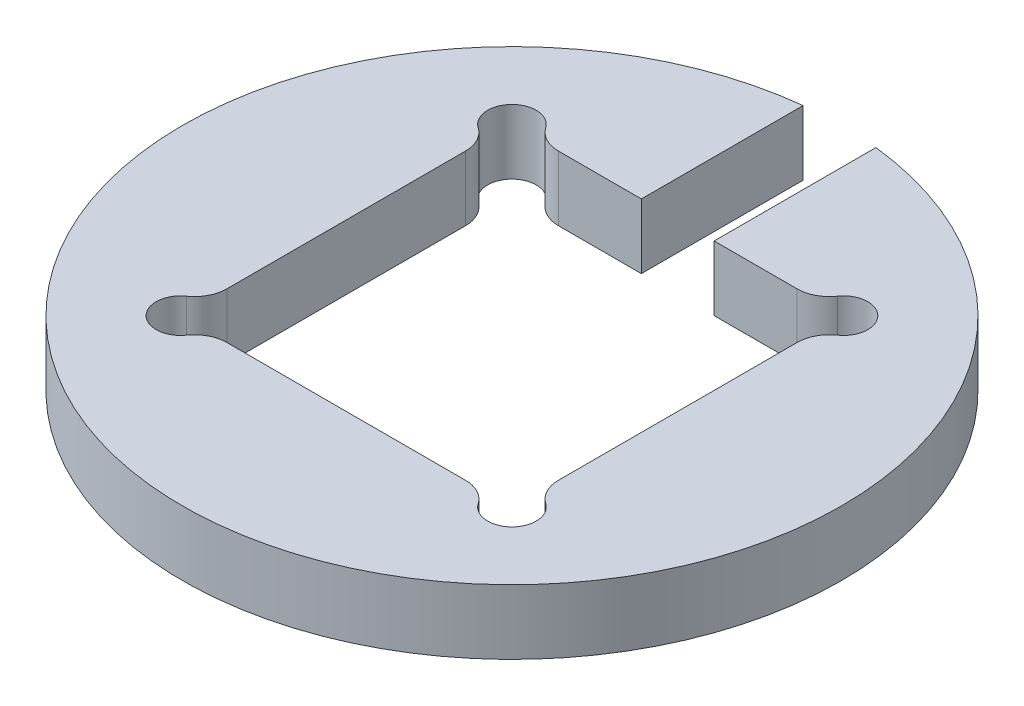
ISO-10303-21;
HEADER;
FILE_DESCRIPTION(('STEP AP214'),'2;1');
FILE_NAME('part.step','',(''),(''),'','','');
FILE_SCHEMA(('AUTOMOTIVE_DESIGN { 1 0 10303 214 1 1 1 1 }'));
ENDSEC;
DATA;
#1=APPLICATION_CONTEXT('core data for automotive mechanical design processes');
#2=APPLICATION_PROTOCOL_DEFINITION('international standard','automotive_design',2000,#1);
#3=PRODUCT_CONTEXT('',#1,'mechanical');
#4=PRODUCT('Part','Part','',(#3));
#5=PRODUCT_RELATED_PRODUCT_CATEGORY('part','',(#4));
#6=PRODUCT_DEFINITION_FORMATION('','',#4);
#7=PRODUCT_DEFINITION_CONTEXT('part definition',#1,'design');
#8=PRODUCT_DEFINITION('design','',#6,#7);
#9=PRODUCT_DEFINITION_SHAPE('','',#8);
#10=(LENGTH_UNIT() NAMED_UNIT(*) SI_UNIT(.MILLI.,.METRE.));
#11=(NAMED_UNIT(*) PLANE_ANGLE_UNIT() SI_UNIT($,.RADIAN.));
#12=(NAMED_UNIT(*) SI_UNIT($,.STERADIAN.) SOLID_ANGLE_UNIT());
#13=UNCERTAINTY_MEASURE_WITH_UNIT(LENGTH_MEASURE(1.E-05),#10,'distance_accuracy_value','');
#14=(GEOMETRIC_REPRESENTATION_CONTEXT(3) GLOBAL_UNCERTAINTY_ASSIGNED_CONTEXT((#13)) GLOBAL_UNIT_ASSIGNED_CONTEXT((#10,
#11,#12)) REPRESENTATION_CONTEXT('',''));
#15=CARTESIAN_POINT('',(0.,0.,0.));
#16=DIRECTION('',(0.,0.,1.));
#17=DIRECTION('',(1.,0.,0.));
#18=AXIS2_PLACEMENT_3D('',#15,#16,#17);
#19=CARTESIAN_POINT('',(0.,4.,-20.5));
#20=DIRECTION('',(0.,-1.,0.));
#21=DIRECTION('',(0.,0.,-1.));
#22=AXIS2_PLACEMENT_3D('',#19,#20,#21);
#23=CYLINDRICAL_SURFACE('',#22,1.5);
#24=CARTESIAN_POINT('',(0.,4.,-20.5));
#25=DIRECTION('',(0.,1.,0.));
#26=DIRECTION('',(0.,0.,1.));
#27=AXIS2_PLACEMENT_3D('',#24,#25,#26);
#28=CIRCLE('',#27,1.5);
#29=CARTESIAN_POINT('',(1.23097770997243,4.,-21.3571428571429));
#30=VERTEX_POINT('',#29);
#31=CARTESIAN_POINT('',(-0.857142857142857,4.,-19.2690222900276));
#32=VERTEX_POINT('',#31);
#33=EDGE_CURVE('E185',#30,#32,#28,.T.);
#34=ORIENTED_EDGE('',*,*,#33,.T.);
#35=DIRECTION('',(0.,-1.,0.));
#36=VECTOR('',#35,1.);
#37=CARTESIAN_POINT('',(-0.857142857142857,4.,-19.2690222900276));
#38=LINE('',#37,#36);
#39=CARTESIAN_POINT('',(-0.857142857142857,0.,-19.2690222900276));
#40=VERTEX_POINT('',#39);
#41=EDGE_CURVE('E322',#32,#40,#38,.T.);
#42=ORIENTED_EDGE('',*,*,#41,.T.);
#43=CARTESIAN_POINT('',(0.,0.,-20.5));
#44=DIRECTION('',(0.,1.,0.));
#45=DIRECTION('',(0.,0.,1.));
#46=AXIS2_PLACEMENT_3D('',#43,#44,#45);
#47=CIRCLE('',#46,1.5);
#48=CARTESIAN_POINT('',(1.23097770997243,0.,-21.3571428571429));
#49=VERTEX_POINT('',#48);
#50=EDGE_CURVE('E226',#49,#40,#47,.T.);
#51=ORIENTED_EDGE('',*,*,#50,.F.);
#52=DIRECTION('',(0.,-1.,0.));
#53=VECTOR('',#52,1.);
#54=CARTESIAN_POINT('',(1.23097770997244,4.,-21.3571428571429));
#55=LINE('',#54,#53);
#56=EDGE_CURVE('E320',#49,#30,#55,.F.);
#57=ORIENTED_EDGE('',*,*,#56,.T.);
#58=EDGE_LOOP('',(#34,#42,#51,#57));
#59=FACE_BOUND('',#58,.T.);
#60=ADVANCED_FACE('F35',(#59),#23,.F.);
#61=CARTESIAN_POINT('',(0.,4.,-20.5));
#62=DIRECTION('',(0.,0.,-1.));
#63=DIRECTION('',(-1.,0.,0.));
#64=AXIS2_PLACEMENT_3D('',#61,#62,#63);
#65=PLANE('',#64);
#66=DIRECTION('',(1.,0.,0.));
#67=VECTOR('',#66,1.);
#68=CARTESIAN_POINT('',(0.,4.,-20.5));
#69=LINE('',#68,#67);
#70=CARTESIAN_POINT('',(2.87228132326902,4.,-20.5));
#71=VERTEX_POINT('',#70);
#72=CARTESIAN_POINT('',(8.,4.,-20.5));
#73=VERTEX_POINT('',#72);
#74=EDGE_CURVE('E172',#71,#73,#69,.T.);
#75=ORIENTED_EDGE('',*,*,#74,.F.);
#76=DIRECTION('',(0.,1.,0.));
#77=VECTOR('',#76,1.);
#78=CARTESIAN_POINT('',(2.87228132326902,0.,-20.5));
#79=LINE('',#78,#77);
#80=CARTESIAN_POINT('',(2.87228132326902,0.,-20.5));
#81=VERTEX_POINT('',#80);
#82=EDGE_CURVE('E11',#71,#81,#79,.F.);
#83=ORIENTED_EDGE('',*,*,#82,.T.);
#84=DIRECTION('',(1.,0.,0.));
#85=VECTOR('',#84,1.);
#86=CARTESIAN_POINT('',(0.,0.,-20.5));
#87=LINE('',#86,#85);
#88=CARTESIAN_POINT('',(8.,0.,-20.5));
#89=VERTEX_POINT('',#88);
#90=EDGE_CURVE('E191',#81,#89,#87,.T.);
#91=ORIENTED_EDGE('',*,*,#90,.T.);
#92=DIRECTION('',(0.,-1.,0.));
#93=VECTOR('',#92,1.);
#94=CARTESIAN_POINT('',(8.,4.,-20.5));
#95=LINE('',#94,#93);
#96=EDGE_CURVE('E188',#73,#89,#95,.T.);
#97=ORIENTED_EDGE('',*,*,#96,.F.);
#98=EDGE_LOOP('',(#75,#83,#91,#97));
#99=FACE_BOUND('',#98,.T.);
#100=ADVANCED_FACE('F189',(#99),#65,.F.);
#101=CARTESIAN_POINT('',(8.,4.,0.));
#102=DIRECTION('',(-1.,0.,0.));
#103=DIRECTION('',(0.,0.,1.));
#104=AXIS2_PLACEMENT_3D('',#101,#102,#103);
#105=PLANE('',#104);
#106=DIRECTION('',(0.,0.,-1.));
#107=VECTOR('',#106,1.);
#108=CARTESIAN_POINT('',(8.,0.,0.));
#109=LINE('',#108,#107);
#110=CARTESIAN_POINT('',(8.,0.,-30.5));
#111=VERTEX_POINT('',#110);
#112=EDGE_CURVE('E230',#89,#111,#109,.T.);
#113=ORIENTED_EDGE('',*,*,#112,.T.);
#114=DIRECTION('',(0.,-1.,0.));
#115=VECTOR('',#114,1.);
#116=CARTESIAN_POINT('',(8.,4.,-30.5));
#117=LINE('',#116,#115);
#118=CARTESIAN_POINT('',(8.,4.,-30.5));
#119=VERTEX_POINT('',#118);
#120=EDGE_CURVE('E196',#119,#111,#117,.T.);
#121=ORIENTED_EDGE('',*,*,#120,.F.);
#122=DIRECTION('',(0.,0.,-1.));
#123=VECTOR('',#122,1.);
#124=CARTESIAN_POINT('',(8.,4.,0.));
#125=LINE('',#124,#123);
#126=EDGE_CURVE('E178',#73,#119,#125,.T.);
#127=ORIENTED_EDGE('',*,*,#126,.F.);
#128=ORIENTED_EDGE('',*,*,#96,.T.);
#129=EDGE_LOOP('',(#113,#121,#127,#128));
#130=FACE_BOUND('',#129,.T.);
#131=ADVANCED_FACE('F198',(#130),#105,.F.);
#132=CARTESIAN_POINT('',(10.25,4.,-10.25));
#133=DIRECTION('',(0.,-1.,0.));
#134=DIRECTION('',(0.,0.,-1.));
#135=AXIS2_PLACEMENT_3D('',#132,#133,#134);
#136=CYLINDRICAL_SURFACE('',#135,20.3746165608092);
#137=CARTESIAN_POINT('',(10.25,0.,-10.25));
#138=DIRECTION('',(0.,1.,0.));
#139=DIRECTION('',(0.,0.,1.));
#140=AXIS2_PLACEMENT_3D('',#137,#138,#139);
#141=CIRCLE('',#140,20.3746165608092);
#142=CARTESIAN_POINT('',(12.5,0.,-30.5));
#143=VERTEX_POINT('',#142);
#144=EDGE_CURVE('E232',#143,#111,#141,.F.);
#145=ORIENTED_EDGE('',*,*,#144,.F.);
#146=DIRECTION('',(0.,-1.,0.));
#147=VECTOR('',#146,1.);
#148=CARTESIAN_POINT('',(12.5,4.,-30.5));
#149=LINE('',#148,#147);
#150=CARTESIAN_POINT('',(12.5,4.,-30.5));
#151=VERTEX_POINT('',#150);
#152=EDGE_CURVE('E259',#151,#143,#149,.T.);
#153=ORIENTED_EDGE('',*,*,#152,.F.);
#154=CARTESIAN_POINT('',(10.25,4.,-10.25));
#155=DIRECTION('',(0.,1.,0.));
#156=DIRECTION('',(0.,0.,1.));
#157=AXIS2_PLACEMENT_3D('',#154,#155,#156);
#158=CIRCLE('',#157,20.3746165608092);
#159=EDGE_CURVE('E200',#151,#119,#158,.F.);
#160=ORIENTED_EDGE('',*,*,#159,.T.);
#161=ORIENTED_EDGE('',*,*,#120,.T.);
#162=EDGE_LOOP('',(#145,#153,#160,#161));
#163=FACE_BOUND('',#162,.T.);
#164=ADVANCED_FACE('F528',(#163),#136,.T.);
#165=CARTESIAN_POINT('',(12.5,4.,0.));
#166=DIRECTION('',(-1.,0.,0.));
#167=DIRECTION('',(0.,0.,1.));
#168=AXIS2_PLACEMENT_3D('',#165,#166,#167);
#169=PLANE('',#168);
#170=DIRECTION('',(0.,0.,-1.));
#171=VECTOR('',#170,1.);
#172=CARTESIAN_POINT('',(12.5,0.,0.));
#173=LINE('',#172,#171);
#174=CARTESIAN_POINT('',(12.5,0.,-20.5));
#175=VERTEX_POINT('',#174);
#176=EDGE_CURVE('E235',#175,#143,#173,.T.);
#177=ORIENTED_EDGE('',*,*,#176,.F.);
#178=DIRECTION('',(0.,-1.,0.));
#179=VECTOR('',#178,1.);
#180=CARTESIAN_POINT('',(12.5,4.,-20.5));
#181=LINE('',#180,#179);
#182=CARTESIAN_POINT('',(12.5,4.,-20.5));
#183=VERTEX_POINT('',#182);
#184=EDGE_CURVE('E225',#183,#175,#181,.T.);
#185=ORIENTED_EDGE('',*,*,#184,.F.);
#186=DIRECTION('',(0.,0.,-1.));
#187=VECTOR('',#186,1.);
#188=CARTESIAN_POINT('',(12.5,4.,0.));
#189=LINE('',#188,#187);
#190=EDGE_CURVE('E202',#183,#151,#189,.T.);
#191=ORIENTED_EDGE('',*,*,#190,.T.);
#192=ORIENTED_EDGE('',*,*,#152,.T.);
#193=EDGE_LOOP('',(#177,#185,#191,#192));
#194=FACE_BOUND('',#193,.T.);
#195=ADVANCED_FACE('F519',(#194),#169,.T.);
#196=CARTESIAN_POINT('',(0.,4.,-20.5));
#197=DIRECTION('',(0.,0.,1.));
#198=DIRECTION('',(1.,0.,0.));
#199=AXIS2_PLACEMENT_3D('',#196,#197,#198);
#200=PLANE('',#199);
#201=DIRECTION('',(-1.,0.,0.));
#202=VECTOR('',#201,1.);
#203=CARTESIAN_POINT('',(0.,0.,-20.5));
#204=LINE('',#203,#202);
#205=CARTESIAN_POINT('',(17.627718676731,0.,-20.5));
#206=VERTEX_POINT('',#205);
#207=EDGE_CURVE('E238',#206,#175,#204,.T.);
#208=ORIENTED_EDGE('',*,*,#207,.F.);
#209=DIRECTION('',(0.,1.,0.));
#210=VECTOR('',#209,1.);
#211=CARTESIAN_POINT('',(17.627718676731,4.,-20.5));
#212=LINE('',#211,#210);
#213=CARTESIAN_POINT('',(17.627718676731,4.,-20.5));
#214=VERTEX_POINT('',#213);
#215=EDGE_CURVE('E43',#206,#214,#212,.T.);
#216=ORIENTED_EDGE('',*,*,#215,.T.);
#217=DIRECTION('',(-1.,0.,0.));
#218=VECTOR('',#217,1.);
#219=CARTESIAN_POINT('',(0.,4.,-20.5));
#220=LINE('',#219,#218);
#221=EDGE_CURVE('E208',#214,#183,#220,.T.);
#222=ORIENTED_EDGE('',*,*,#221,.T.);
#223=ORIENTED_EDGE('',*,*,#184,.T.);
#224=EDGE_LOOP('',(#208,#216,#222,#223));
#225=FACE_BOUND('',#224,.T.);
#226=ADVANCED_FACE('F328',(#225),#200,.T.);
#227=CARTESIAN_POINT('',(20.5,4.,-20.5));
#228=DIRECTION('',(0.,-1.,0.));
#229=DIRECTION('',(0.,0.,-1.));
#230=AXIS2_PLACEMENT_3D('',#227,#228,#229);
#231=CYLINDRICAL_SURFACE('',#230,1.5);
#232=CARTESIAN_POINT('',(20.5,0.,-20.5));
#233=DIRECTION('',(0.,1.,0.));
#234=DIRECTION('',(0.,0.,1.));
#235=AXIS2_PLACEMENT_3D('',#232,#233,#234);
#236=CIRCLE('',#235,1.5);
#237=CARTESIAN_POINT('',(19.2690222900276,0.,-21.3571428571429));
#238=VERTEX_POINT('',#237);
#239=CARTESIAN_POINT('',(21.3571428571429,0.,-19.2690222900276));
#240=VERTEX_POINT('',#239);
#241=EDGE_CURVE('E240',#238,#240,#236,.F.);
#242=ORIENTED_EDGE('',*,*,#241,.T.);
#243=DIRECTION('',(0.,-1.,0.));
#244=VECTOR('',#243,1.);
#245=CARTESIAN_POINT('',(21.3571428571429,4.,-19.2690222900276));
#246=LINE('',#245,#244);
#247=CARTESIAN_POINT('',(21.3571428571429,4.,-19.2690222900276));
#248=VERTEX_POINT('',#247);
#249=EDGE_CURVE('E309',#240,#248,#246,.F.);
#250=ORIENTED_EDGE('',*,*,#249,.T.);
#251=CARTESIAN_POINT('',(20.5,4.,-20.5));
#252=DIRECTION('',(0.,1.,0.));
#253=DIRECTION('',(0.,0.,1.));
#254=AXIS2_PLACEMENT_3D('',#251,#252,#253);
#255=CIRCLE('',#254,1.5);
#256=CARTESIAN_POINT('',(19.2690222900276,4.,-21.3571428571429));
#257=VERTEX_POINT('',#256);
#258=EDGE_CURVE('E210',#257,#248,#255,.F.);
#259=ORIENTED_EDGE('',*,*,#258,.F.);
#260=DIRECTION('',(0.,-1.,0.));
#261=VECTOR('',#260,1.);
#262=CARTESIAN_POINT('',(19.2690222900276,4.,-21.3571428571429));
#263=LINE('',#262,#261);
#264=EDGE_CURVE('E306',#257,#238,#263,.T.);
#265=ORIENTED_EDGE('',*,*,#264,.T.);
#266=EDGE_LOOP('',(#242,#250,#259,#265));
#267=FACE_BOUND('',#266,.T.);
#268=ADVANCED_FACE('F338',(#267),#231,.F.);
#269=CARTESIAN_POINT('',(20.5,4.,0.));
#270=DIRECTION('',(-1.,0.,0.));
#271=DIRECTION('',(0.,0.,1.));
#272=AXIS2_PLACEMENT_3D('',#269,#270,#271);
#273=PLANE('',#272);
#274=DIRECTION('',(0.,0.,-1.));
#275=VECTOR('',#274,1.);
#276=CARTESIAN_POINT('',(20.5,0.,0.));
#277=LINE('',#276,#275);
#278=CARTESIAN_POINT('',(20.5,0.,-2.87228132326902));
#279=VERTEX_POINT('',#278);
#280=CARTESIAN_POINT('',(20.5,0.,-17.627718676731));
#281=VERTEX_POINT('',#280);
#282=EDGE_CURVE('E243',#279,#281,#277,.T.);
#283=ORIENTED_EDGE('',*,*,#282,.F.);
#284=DIRECTION('',(0.,1.,0.));
#285=VECTOR('',#284,1.);
#286=CARTESIAN_POINT('',(20.5,4.,-2.87228132326902));
#287=LINE('',#286,#285);
#288=CARTESIAN_POINT('',(20.5,4.,-2.87228132326902));
#289=VERTEX_POINT('',#288);
#290=EDGE_CURVE('E304',#279,#289,#287,.T.);
#291=ORIENTED_EDGE('',*,*,#290,.T.);
#292=DIRECTION('',(0.,0.,-1.));
#293=VECTOR('',#292,1.);
#294=CARTESIAN_POINT('',(20.5,4.,0.));
#295=LINE('',#294,#293);
#296=CARTESIAN_POINT('',(20.5,4.,-17.627718676731));
#297=VERTEX_POINT('',#296);
#298=EDGE_CURVE('E213',#289,#297,#295,.T.);
#299=ORIENTED_EDGE('',*,*,#298,.T.);
#300=DIRECTION('',(0.,1.,0.));
#301=VECTOR('',#300,1.);
#302=CARTESIAN_POINT('',(20.5,0.,-17.627718676731));
#303=LINE('',#302,#301);
#304=EDGE_CURVE('E301',#297,#281,#303,.F.);
#305=ORIENTED_EDGE('',*,*,#304,.T.);
#306=EDGE_LOOP('',(#283,#291,#299,#305));
#307=FACE_BOUND('',#306,.T.);
#308=ADVANCED_FACE('F348',(#307),#273,.T.);
#309=CARTESIAN_POINT('',(20.5,4.,0.));
#310=DIRECTION('',(0.,-1.,0.));
#311=DIRECTION('',(0.,0.,-1.));
#312=AXIS2_PLACEMENT_3D('',#309,#310,#311);
#313=CYLINDRICAL_SURFACE('',#312,1.5);
#314=CARTESIAN_POINT('',(20.5,0.,0.));
#315=DIRECTION('',(0.,1.,0.));
#316=DIRECTION('',(0.,0.,1.));
#317=AXIS2_PLACEMENT_3D('',#314,#315,#316);
#318=CIRCLE('',#317,1.5);
#319=CARTESIAN_POINT('',(21.3571428571429,0.,-1.23097770997243));
#320=VERTEX_POINT('',#319);
#321=CARTESIAN_POINT('',(19.2690222900276,0.,0.857142857142857));
#322=VERTEX_POINT('',#321);
#323=EDGE_CURVE('E246',#320,#322,#318,.F.);
#324=ORIENTED_EDGE('',*,*,#323,.T.);
#325=DIRECTION('',(0.,-1.,0.));
#326=VECTOR('',#325,1.);
#327=CARTESIAN_POINT('',(19.2690222900276,4.,0.857142857142857));
#328=LINE('',#327,#326);
#329=CARTESIAN_POINT('',(19.2690222900276,4.,0.857142857142857));
#330=VERTEX_POINT('',#329);
#331=EDGE_CURVE('E285',#322,#330,#328,.F.);
#332=ORIENTED_EDGE('',*,*,#331,.T.);
#333=CARTESIAN_POINT('',(20.5,4.,0.));
#334=DIRECTION('',(0.,1.,0.));
#335=DIRECTION('',(0.,0.,1.));
#336=AXIS2_PLACEMENT_3D('',#333,#334,#335);
#337=CIRCLE('',#336,1.5);
#338=CARTESIAN_POINT('',(21.3571428571429,4.,-1.23097770997243));
#339=VERTEX_POINT('',#338);
#340=EDGE_CURVE('E216',#339,#330,#337,.F.);
#341=ORIENTED_EDGE('',*,*,#340,.F.);
#342=DIRECTION('',(0.,-1.,0.));
#343=VECTOR('',#342,1.);
#344=CARTESIAN_POINT('',(21.3571428571429,4.,-1.23097770997244));
#345=LINE('',#344,#343);
#346=EDGE_CURVE('E282',#339,#320,#345,.T.);
#347=ORIENTED_EDGE('',*,*,#346,.T.);
#348=EDGE_LOOP('',(#324,#332,#341,#347));
#349=FACE_BOUND('',#348,.T.);
#350=ADVANCED_FACE('F358',(#349),#313,.F.);
#351=CARTESIAN_POINT('',(0.,4.,0.));
#352=DIRECTION('',(0.,0.,-1.));
#353=DIRECTION('',(-1.,0.,0.));
#354=AXIS2_PLACEMENT_3D('',#351,#352,#353);
#355=PLANE('',#354);
#356=DIRECTION('',(1.,0.,0.));
#357=VECTOR('',#356,1.);
#358=CARTESIAN_POINT('',(0.,4.,0.));
#359=LINE('',#358,#357);
#360=CARTESIAN_POINT('',(2.87228132326901,4.,0.));
#361=VERTEX_POINT('',#360);
#362=CARTESIAN_POINT('',(17.627718676731,4.,0.));
#363=VERTEX_POINT('',#362);
#364=EDGE_CURVE('E218',#361,#363,#359,.T.);
#365=ORIENTED_EDGE('',*,*,#364,.T.);
#366=DIRECTION('',(0.,1.,0.));
#367=VECTOR('',#366,1.);
#368=CARTESIAN_POINT('',(17.627718676731,0.,0.));
#369=LINE('',#368,#367);
#370=CARTESIAN_POINT('',(17.627718676731,0.,0.));
#371=VERTEX_POINT('',#370);
#372=EDGE_CURVE('E263',#363,#371,#369,.F.);
#373=ORIENTED_EDGE('',*,*,#372,.T.);
#374=DIRECTION('',(1.,0.,0.));
#375=VECTOR('',#374,1.);
#376=CARTESIAN_POINT('',(0.,0.,0.));
#377=LINE('',#376,#375);
#378=CARTESIAN_POINT('',(2.87228132326901,0.,0.));
#379=VERTEX_POINT('',#378);
#380=EDGE_CURVE('E249',#379,#371,#377,.T.);
#381=ORIENTED_EDGE('',*,*,#380,.F.);
#382=DIRECTION('',(0.,1.,0.));
#383=VECTOR('',#382,1.);
#384=CARTESIAN_POINT('',(2.87228132326901,4.,0.));
#385=LINE('',#384,#383);
#386=EDGE_CURVE('E195',#379,#361,#385,.T.);
#387=ORIENTED_EDGE('',*,*,#386,.T.);
#388=EDGE_LOOP('',(#365,#373,#381,#387));
#389=FACE_BOUND('',#388,.T.);
#390=ADVANCED_FACE('F366',(#389),#355,.T.);
#391=CARTESIAN_POINT('',(0.,4.,0.));
#392=DIRECTION('',(0.,-1.,0.));
#393=DIRECTION('',(0.,0.,-1.));
#394=AXIS2_PLACEMENT_3D('',#391,#392,#393);
#395=CYLINDRICAL_SURFACE('',#394,1.5);
#396=CARTESIAN_POINT('',(0.,0.,0.));
#397=DIRECTION('',(0.,1.,0.));
#398=DIRECTION('',(0.,0.,1.));
#399=AXIS2_PLACEMENT_3D('',#396,#397,#398);
#400=CIRCLE('',#399,1.5);
#401=CARTESIAN_POINT('',(1.23097770997243,0.,0.857142857142857));
#402=VERTEX_POINT('',#401);
#403=CARTESIAN_POINT('',(-0.857142857142857,0.,-1.23097770997243));
#404=VERTEX_POINT('',#403);
#405=EDGE_CURVE('E252',#402,#404,#400,.F.);
#406=ORIENTED_EDGE('',*,*,#405,.T.);
#407=DIRECTION('',(0.,-1.,0.));
#408=VECTOR('',#407,1.);
#409=CARTESIAN_POINT('',(-0.857142857142857,4.,-1.23097770997243));
#410=LINE('',#409,#408);
#411=CARTESIAN_POINT('',(-0.857142857142857,4.,-1.23097770997243));
#412=VERTEX_POINT('',#411);
#413=EDGE_CURVE('E318',#404,#412,#410,.F.);
#414=ORIENTED_EDGE('',*,*,#413,.T.);
#415=CARTESIAN_POINT('',(0.,4.,0.));
#416=DIRECTION('',(0.,1.,0.));
#417=DIRECTION('',(0.,0.,1.));
#418=AXIS2_PLACEMENT_3D('',#415,#416,#417);
#419=CIRCLE('',#418,1.5);
#420=CARTESIAN_POINT('',(1.23097770997243,4.,0.857142857142857));
#421=VERTEX_POINT('',#420);
#422=EDGE_CURVE('E221',#421,#412,#419,.F.);
#423=ORIENTED_EDGE('',*,*,#422,.F.);
#424=DIRECTION('',(0.,-1.,0.));
#425=VECTOR('',#424,1.);
#426=CARTESIAN_POINT('',(1.23097770997243,4.,0.857142857142857));
#427=LINE('',#426,#425);
#428=EDGE_CURVE('E315',#421,#402,#427,.T.);
#429=ORIENTED_EDGE('',*,*,#428,.T.);
#430=EDGE_LOOP('',(#406,#414,#423,#429));
#431=FACE_BOUND('',#430,.T.);
#432=ADVANCED_FACE('F376',(#431),#395,.F.);
#433=CARTESIAN_POINT('',(0.,4.,0.));
#434=DIRECTION('',(-1.,0.,0.));
#435=DIRECTION('',(0.,0.,1.));
#436=AXIS2_PLACEMENT_3D('',#433,#434,#435);
#437=PLANE('',#436);
#438=DIRECTION('',(0.,0.,-1.));
#439=VECTOR('',#438,1.);
#440=CARTESIAN_POINT('',(0.,4.,0.));
#441=LINE('',#440,#439);
#442=CARTESIAN_POINT('',(0.,4.,-2.87228132326901));
#443=VERTEX_POINT('',#442);
#444=CARTESIAN_POINT('',(0.,4.,-17.627718676731));
#445=VERTEX_POINT('',#444);
#446=EDGE_CURVE('E223',#443,#445,#441,.T.);
#447=ORIENTED_EDGE('',*,*,#446,.F.);
#448=DIRECTION('',(0.,-1.,0.));
#449=VECTOR('',#448,1.);
#450=CARTESIAN_POINT('',(0.,4.,-2.87228132326901));
#451=LINE('',#450,#449);
#452=CARTESIAN_POINT('',(0.,0.,-2.87228132326901));
#453=VERTEX_POINT('',#452);
#454=EDGE_CURVE('E312',#443,#453,#451,.T.);
#455=ORIENTED_EDGE('',*,*,#454,.T.);
#456=DIRECTION('',(0.,0.,-1.));
#457=VECTOR('',#456,1.);
#458=CARTESIAN_POINT('',(0.,0.,0.));
#459=LINE('',#458,#457);
#460=CARTESIAN_POINT('',(0.,0.,-17.627718676731));
#461=VERTEX_POINT('',#460);
#462=EDGE_CURVE('E255',#453,#461,#459,.T.);
#463=ORIENTED_EDGE('',*,*,#462,.T.);
#464=DIRECTION('',(0.,1.,0.));
#465=VECTOR('',#464,1.);
#466=CARTESIAN_POINT('',(0.,4.,-17.627718676731));
#467=LINE('',#466,#465);
#468=EDGE_CURVE('E50',#461,#445,#467,.T.);
#469=ORIENTED_EDGE('',*,*,#468,.T.);
#470=EDGE_LOOP('',(#447,#455,#463,#469));
#471=FACE_BOUND('',#470,.T.);
#472=ADVANCED_FACE('F382',(#471),#437,.F.);
#473=CARTESIAN_POINT('',(0.,4.,0.));
#474=DIRECTION('',(0.,1.,0.));
#475=DIRECTION('',(0.,0.,1.));
#476=AXIS2_PLACEMENT_3D('',#473,#474,#475);
#477=PLANE('',#476);
#478=ORIENTED_EDGE('',*,*,#340,.T.);
#479=CARTESIAN_POINT('',(17.627718676731,4.,2.));
#480=DIRECTION('',(0.,1.,0.));
#481=DIRECTION('',(0.,0.,1.));
#482=AXIS2_PLACEMENT_3D('',#479,#480,#481);
#483=CIRCLE('',#482,2.);
#484=EDGE_CURVE('E299',#330,#363,#483,.T.);
#485=ORIENTED_EDGE('',*,*,#484,.T.);
#486=ORIENTED_EDGE('',*,*,#364,.F.);
#487=CARTESIAN_POINT('',(2.87228132326901,4.,2.));
#488=DIRECTION('',(0.,1.,0.));
#489=DIRECTION('',(0.,0.,1.));
#490=AXIS2_PLACEMENT_3D('',#487,#488,#489);
#491=CIRCLE('',#490,2.);
#492=EDGE_CURVE('E292',#361,#421,#491,.T.);
#493=ORIENTED_EDGE('',*,*,#492,.T.);
#494=ORIENTED_EDGE('',*,*,#422,.T.);
#495=CARTESIAN_POINT('',(-2.,4.,-2.87228132326901));
#496=DIRECTION('',(0.,1.,0.));
#497=DIRECTION('',(0.,0.,1.));
#498=AXIS2_PLACEMENT_3D('',#495,#496,#497);
#499=CIRCLE('',#498,2.);
#500=EDGE_CURVE('E57',#412,#443,#499,.T.);
#501=ORIENTED_EDGE('',*,*,#500,.T.);
#502=ORIENTED_EDGE('',*,*,#446,.T.);
#503=CARTESIAN_POINT('',(-2.,4.,-17.627718676731));
#504=DIRECTION('',(0.,1.,0.));
#505=DIRECTION('',(0.,0.,1.));
#506=AXIS2_PLACEMENT_3D('',#503,#504,#505);
#507=CIRCLE('',#506,2.);
#508=EDGE_CURVE('E290',#445,#32,#507,.T.);
#509=ORIENTED_EDGE('',*,*,#508,.T.);
#510=ORIENTED_EDGE('',*,*,#33,.F.);
#511=CARTESIAN_POINT('',(2.87228132326902,4.,-22.5));
#512=DIRECTION('',(0.,1.,0.));
#513=DIRECTION('',(0.,0.,1.));
#514=AXIS2_PLACEMENT_3D('',#511,#512,#513);
#515=CIRCLE('',#514,2.);
#516=EDGE_CURVE('E182',#30,#71,#515,.T.);
#517=ORIENTED_EDGE('',*,*,#516,.T.);
#518=ORIENTED_EDGE('',*,*,#74,.T.);
#519=ORIENTED_EDGE('',*,*,#126,.T.);
#520=ORIENTED_EDGE('',*,*,#159,.F.);
#521=ORIENTED_EDGE('',*,*,#190,.F.);
#522=ORIENTED_EDGE('',*,*,#221,.F.);
#523=CARTESIAN_POINT('',(17.627718676731,4.,-22.5));
#524=DIRECTION('',(0.,1.,0.));
#525=DIRECTION('',(0.,0.,1.));
#526=AXIS2_PLACEMENT_3D('',#523,#524,#525);
#527=CIRCLE('',#526,2.);
#528=EDGE_CURVE('E288',#214,#257,#527,.T.);
#529=ORIENTED_EDGE('',*,*,#528,.T.);
#530=ORIENTED_EDGE('',*,*,#258,.T.);
#531=CARTESIAN_POINT('',(22.5,4.,-17.627718676731));
#532=DIRECTION('',(0.,1.,0.));
#533=DIRECTION('',(0.,0.,1.));
#534=AXIS2_PLACEMENT_3D('',#531,#532,#533);
#535=CIRCLE('',#534,2.);
#536=EDGE_CURVE('E295',#248,#297,#535,.T.);
#537=ORIENTED_EDGE('',*,*,#536,.T.);
#538=ORIENTED_EDGE('',*,*,#298,.F.);
#539=CARTESIAN_POINT('',(22.5,4.,-2.87228132326902));
#540=DIRECTION('',(0.,1.,0.));
#541=DIRECTION('',(0.,0.,1.));
#542=AXIS2_PLACEMENT_3D('',#539,#540,#541);
#543=CIRCLE('',#542,2.);
#544=EDGE_CURVE('E297',#289,#339,#543,.T.);
#545=ORIENTED_EDGE('',*,*,#544,.T.);
#546=EDGE_LOOP('',(#478,#485,#486,#493,#494,#501,#502,#509,#510,#517,#518,#519,#520,#521,#522,
#529,#530,#537,#538,#545));
#547=FACE_BOUND('',#546,.T.);
#548=ADVANCED_FACE('F175',(#547),#477,.T.);
#549=CARTESIAN_POINT('',(0.,0.,0.));
#550=DIRECTION('',(0.,1.,0.));
#551=DIRECTION('',(0.,0.,1.));
#552=AXIS2_PLACEMENT_3D('',#549,#550,#551);
#553=PLANE('',#552);
#554=ORIENTED_EDGE('',*,*,#380,.T.);
#555=CARTESIAN_POINT('',(17.627718676731,0.,2.));
#556=DIRECTION('',(0.,1.,0.));
#557=DIRECTION('',(0.,0.,1.));
#558=AXIS2_PLACEMENT_3D('',#555,#556,#557);
#559=CIRCLE('',#558,2.);
#560=EDGE_CURVE('E280',#371,#322,#559,.F.);
#561=ORIENTED_EDGE('',*,*,#560,.T.);
#562=ORIENTED_EDGE('',*,*,#323,.F.);
#563=CARTESIAN_POINT('',(22.5,0.,-2.87228132326902));
#564=DIRECTION('',(0.,1.,0.));
#565=DIRECTION('',(0.,0.,1.));
#566=AXIS2_PLACEMENT_3D('',#563,#564,#565);
#567=CIRCLE('',#566,2.);
#568=EDGE_CURVE('E278',#320,#279,#567,.F.);
#569=ORIENTED_EDGE('',*,*,#568,.T.);
#570=ORIENTED_EDGE('',*,*,#282,.T.);
#571=CARTESIAN_POINT('',(22.5,0.,-17.627718676731));
#572=DIRECTION('',(0.,1.,0.));
#573=DIRECTION('',(0.,0.,1.));
#574=AXIS2_PLACEMENT_3D('',#571,#572,#573);
#575=CIRCLE('',#574,2.);
#576=EDGE_CURVE('E276',#281,#240,#575,.F.);
#577=ORIENTED_EDGE('',*,*,#576,.T.);
#578=ORIENTED_EDGE('',*,*,#241,.F.);
#579=CARTESIAN_POINT('',(17.627718676731,0.,-22.5));
#580=DIRECTION('',(0.,1.,0.));
#581=DIRECTION('',(0.,0.,1.));
#582=AXIS2_PLACEMENT_3D('',#579,#580,#581);
#583=CIRCLE('',#582,2.);
#584=EDGE_CURVE('E268',#238,#206,#583,.F.);
#585=ORIENTED_EDGE('',*,*,#584,.T.);
#586=ORIENTED_EDGE('',*,*,#207,.T.);
#587=ORIENTED_EDGE('',*,*,#176,.T.);
#588=ORIENTED_EDGE('',*,*,#144,.T.);
#589=ORIENTED_EDGE('',*,*,#112,.F.);
#590=ORIENTED_EDGE('',*,*,#90,.F.);
#591=CARTESIAN_POINT('',(2.87228132326902,0.,-22.5));
#592=DIRECTION('',(0.,1.,0.));
#593=DIRECTION('',(0.,0.,1.));
#594=AXIS2_PLACEMENT_3D('',#591,#592,#593);
#595=CIRCLE('',#594,2.);
#596=EDGE_CURVE('E266',#81,#49,#595,.F.);
#597=ORIENTED_EDGE('',*,*,#596,.T.);
#598=ORIENTED_EDGE('',*,*,#50,.T.);
#599=CARTESIAN_POINT('',(-2.,0.,-17.627718676731));
#600=DIRECTION('',(0.,1.,0.));
#601=DIRECTION('',(0.,0.,1.));
#602=AXIS2_PLACEMENT_3D('',#599,#600,#601);
#603=CIRCLE('',#602,2.);
#604=EDGE_CURVE('E270',#40,#461,#603,.F.);
#605=ORIENTED_EDGE('',*,*,#604,.T.);
#606=ORIENTED_EDGE('',*,*,#462,.F.);
#607=CARTESIAN_POINT('',(-2.,0.,-2.87228132326901));
#608=DIRECTION('',(0.,1.,0.));
#609=DIRECTION('',(0.,0.,1.));
#610=AXIS2_PLACEMENT_3D('',#607,#608,#609);
#611=CIRCLE('',#610,2.);
#612=EDGE_CURVE('E274',#453,#404,#611,.F.);
#613=ORIENTED_EDGE('',*,*,#612,.T.);
#614=ORIENTED_EDGE('',*,*,#405,.F.);
#615=CARTESIAN_POINT('',(2.87228132326901,0.,2.));
#616=DIRECTION('',(0.,1.,0.));
#617=DIRECTION('',(0.,0.,1.));
#618=AXIS2_PLACEMENT_3D('',#615,#616,#617);
#619=CIRCLE('',#618,2.);
#620=EDGE_CURVE('E272',#402,#379,#619,.F.);
#621=ORIENTED_EDGE('',*,*,#620,.T.);
#622=EDGE_LOOP('',(#554,#561,#562,#569,#570,#577,#578,#585,#586,#587,#588,#589,#590,#597,#598,
#605,#606,#613,#614,#621));
#623=FACE_BOUND('',#622,.T.);
#624=ADVANCED_FACE('F341',(#623),#553,.F.);
#625=CARTESIAN_POINT('',(17.627718676731,4.,2.));
#626=DIRECTION('',(0.,-1.,0.));
#627=DIRECTION('',(0.,0.,-1.));
#628=AXIS2_PLACEMENT_3D('',#625,#626,#627);
#629=CYLINDRICAL_SURFACE('',#628,2.);
#630=ORIENTED_EDGE('',*,*,#484,.F.);
#631=ORIENTED_EDGE('',*,*,#331,.F.);
#632=ORIENTED_EDGE('',*,*,#560,.F.);
#633=ORIENTED_EDGE('',*,*,#372,.F.);
#634=EDGE_LOOP('',(#630,#631,#632,#633));
#635=FACE_BOUND('',#634,.T.);
#636=ADVANCED_FACE('F364',(#635),#629,.T.);
#637=CARTESIAN_POINT('',(22.5,4.,-2.87228132326902));
#638=DIRECTION('',(0.,-1.,0.));
#639=DIRECTION('',(0.,0.,-1.));
#640=AXIS2_PLACEMENT_3D('',#637,#638,#639);
#641=CYLINDRICAL_SURFACE('',#640,2.);
#642=ORIENTED_EDGE('',*,*,#544,.F.);
#643=ORIENTED_EDGE('',*,*,#290,.F.);
#644=ORIENTED_EDGE('',*,*,#568,.F.);
#645=ORIENTED_EDGE('',*,*,#346,.F.);
#646=EDGE_LOOP('',(#642,#643,#644,#645));
#647=FACE_BOUND('',#646,.T.);
#648=ADVANCED_FACE('F355',(#647),#641,.T.);
#649=CARTESIAN_POINT('',(22.5,4.,-17.627718676731));
#650=DIRECTION('',(0.,-1.,0.));
#651=DIRECTION('',(0.,0.,-1.));
#652=AXIS2_PLACEMENT_3D('',#649,#650,#651);
#653=CYLINDRICAL_SURFACE('',#652,2.);
#654=ORIENTED_EDGE('',*,*,#536,.F.);
#655=ORIENTED_EDGE('',*,*,#249,.F.);
#656=ORIENTED_EDGE('',*,*,#576,.F.);
#657=ORIENTED_EDGE('',*,*,#304,.F.);
#658=EDGE_LOOP('',(#654,#655,#656,#657));
#659=FACE_BOUND('',#658,.T.);
#660=ADVANCED_FACE('F346',(#659),#653,.T.);
#661=CARTESIAN_POINT('',(-2.,4.,-2.87228132326901));
#662=DIRECTION('',(0.,-1.,0.));
#663=DIRECTION('',(0.,0.,-1.));
#664=AXIS2_PLACEMENT_3D('',#661,#662,#663);
#665=CYLINDRICAL_SURFACE('',#664,2.);
#666=ORIENTED_EDGE('',*,*,#500,.F.);
#667=ORIENTED_EDGE('',*,*,#413,.F.);
#668=ORIENTED_EDGE('',*,*,#612,.F.);
#669=ORIENTED_EDGE('',*,*,#454,.F.);
#670=EDGE_LOOP('',(#666,#667,#668,#669));
#671=FACE_BOUND('',#670,.T.);
#672=ADVANCED_FACE('F381',(#671),#665,.T.);
#673=CARTESIAN_POINT('',(2.87228132326901,4.,2.));
#674=DIRECTION('',(0.,-1.,0.));
#675=DIRECTION('',(0.,0.,-1.));
#676=AXIS2_PLACEMENT_3D('',#673,#674,#675);
#677=CYLINDRICAL_SURFACE('',#676,2.);
#678=ORIENTED_EDGE('',*,*,#492,.F.);
#679=ORIENTED_EDGE('',*,*,#386,.F.);
#680=ORIENTED_EDGE('',*,*,#620,.F.);
#681=ORIENTED_EDGE('',*,*,#428,.F.);
#682=EDGE_LOOP('',(#678,#679,#680,#681));
#683=FACE_BOUND('',#682,.T.);
#684=ADVANCED_FACE('F373',(#683),#677,.T.);
#685=CARTESIAN_POINT('',(-2.,4.,-17.627718676731));
#686=DIRECTION('',(0.,-1.,0.));
#687=DIRECTION('',(0.,0.,-1.));
#688=AXIS2_PLACEMENT_3D('',#685,#686,#687);
#689=CYLINDRICAL_SURFACE('',#688,2.);
#690=ORIENTED_EDGE('',*,*,#508,.F.);
#691=ORIENTED_EDGE('',*,*,#468,.F.);
#692=ORIENTED_EDGE('',*,*,#604,.F.);
#693=ORIENTED_EDGE('',*,*,#41,.F.);
#694=EDGE_LOOP('',(#690,#691,#692,#693));
#695=FACE_BOUND('',#694,.T.);
#696=ADVANCED_FACE('F387',(#695),#689,.T.);
#697=CARTESIAN_POINT('',(17.627718676731,4.,-22.5));
#698=DIRECTION('',(0.,-1.,0.));
#699=DIRECTION('',(0.,0.,-1.));
#700=AXIS2_PLACEMENT_3D('',#697,#698,#699);
#701=CYLINDRICAL_SURFACE('',#700,2.);
#702=ORIENTED_EDGE('',*,*,#528,.F.);
#703=ORIENTED_EDGE('',*,*,#215,.F.);
#704=ORIENTED_EDGE('',*,*,#584,.F.);
#705=ORIENTED_EDGE('',*,*,#264,.F.);
#706=EDGE_LOOP('',(#702,#703,#704,#705));
#707=FACE_BOUND('',#706,.T.);
#708=ADVANCED_FACE('F335',(#707),#701,.T.);
#709=CARTESIAN_POINT('',(2.87228132326902,4.,-22.5));
#710=DIRECTION('',(0.,-1.,0.));
#711=DIRECTION('',(0.,0.,-1.));
#712=AXIS2_PLACEMENT_3D('',#709,#710,#711);
#713=CYLINDRICAL_SURFACE('',#712,2.);
#714=ORIENTED_EDGE('',*,*,#516,.F.);
#715=ORIENTED_EDGE('',*,*,#56,.F.);
#716=ORIENTED_EDGE('',*,*,#596,.F.);
#717=ORIENTED_EDGE('',*,*,#82,.F.);
#718=EDGE_LOOP('',(#714,#715,#716,#717));
#719=FACE_BOUND('',#718,.T.);
#720=ADVANCED_FACE('F37',(#719),#713,.T.);
#721=CLOSED_SHELL('',(#60,#100,#131,#164,#195,#226,#268,#308,#350,#390,#432,#472,#548,#624,#636,
#648,#660,#672,#684,#696,#708,#720));
#722=MANIFOLD_SOLID_BREP('B2',#721);
#723=ADVANCED_BREP_SHAPE_REPRESENTATION('',(#18,#722),#14);
#724=SHAPE_DEFINITION_REPRESENTATION(#9,#723);
ENDSEC;
END-ISO-10303-21;
